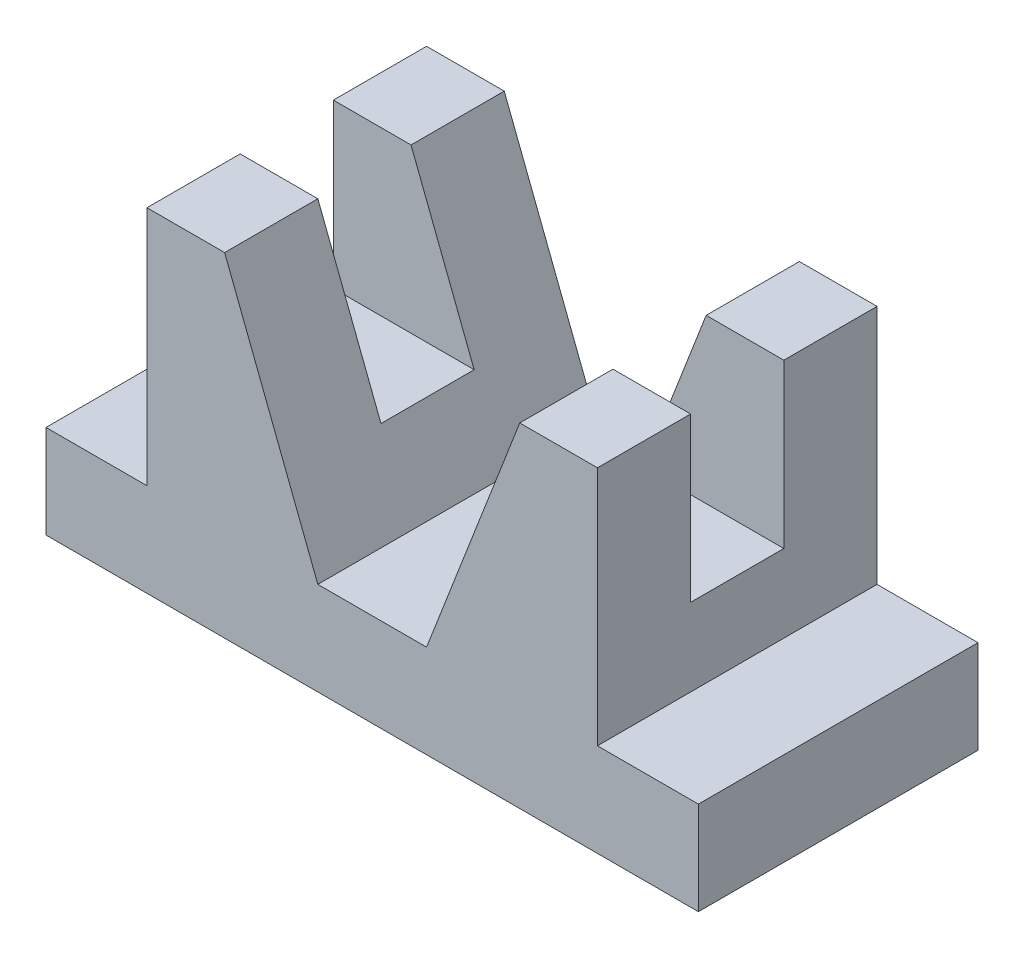
ISO-10303-21;
HEADER;
FILE_DESCRIPTION(('STEP AP214'),'2;1');
FILE_NAME('part.step','',(''),(''),'','','');
FILE_SCHEMA(('AUTOMOTIVE_DESIGN { 1 0 10303 214 1 1 1 1 }'));
ENDSEC;
DATA;
#1=APPLICATION_CONTEXT('core data for automotive mechanical design processes');
#2=APPLICATION_PROTOCOL_DEFINITION('international standard','automotive_design',2000,#1);
#3=PRODUCT_CONTEXT('',#1,'mechanical');
#4=PRODUCT('Part','Part','',(#3));
#5=PRODUCT_RELATED_PRODUCT_CATEGORY('part','',(#4));
#6=PRODUCT_DEFINITION_FORMATION('','',#4);
#7=PRODUCT_DEFINITION_CONTEXT('part definition',#1,'design');
#8=PRODUCT_DEFINITION('design','',#6,#7);
#9=PRODUCT_DEFINITION_SHAPE('','',#8);
#10=(LENGTH_UNIT() NAMED_UNIT(*) SI_UNIT(.MILLI.,.METRE.));
#11=(NAMED_UNIT(*) PLANE_ANGLE_UNIT() SI_UNIT($,.RADIAN.));
#12=(NAMED_UNIT(*) SI_UNIT($,.STERADIAN.) SOLID_ANGLE_UNIT());
#13=UNCERTAINTY_MEASURE_WITH_UNIT(LENGTH_MEASURE(1.E-05),#10,'distance_accuracy_value','');
#14=(GEOMETRIC_REPRESENTATION_CONTEXT(3) GLOBAL_UNCERTAINTY_ASSIGNED_CONTEXT((#13)) GLOBAL_UNIT_ASSIGNED_CONTEXT((#10,
#11,#12)) REPRESENTATION_CONTEXT('',''));
#15=CARTESIAN_POINT('',(0.,0.,0.));
#16=DIRECTION('',(0.,0.,1.));
#17=DIRECTION('',(1.,0.,0.));
#18=AXIS2_PLACEMENT_3D('',#15,#16,#17);
#19=CARTESIAN_POINT('',(-29.,37.,-36.));
#20=DIRECTION('',(0.,1.,0.));
#21=DIRECTION('',(-1.,0.,0.));
#22=AXIS2_PLACEMENT_3D('',#19,#20,#21);
#23=PLANE('',#22);
#24=DIRECTION('',(-1.,0.,0.));
#25=VECTOR('',#24,1.);
#26=CARTESIAN_POINT('',(-29.,37.,-24.));
#27=LINE('',#26,#25);
#28=CARTESIAN_POINT('',(-19.,37.,-24.));
#29=VERTEX_POINT('',#28);
#30=CARTESIAN_POINT('',(-29.,37.,-24.));
#31=VERTEX_POINT('',#30);
#32=EDGE_CURVE('E186',#29,#31,#27,.T.);
#33=ORIENTED_EDGE('',*,*,#32,.F.);
#34=DIRECTION('',(0.,0.,1.));
#35=VECTOR('',#34,1.);
#36=CARTESIAN_POINT('',(-19.,37.,-36.));
#37=LINE('',#36,#35);
#38=CARTESIAN_POINT('',(-19.,37.,-36.));
#39=VERTEX_POINT('',#38);
#40=EDGE_CURVE('E301',#39,#29,#37,.T.);
#41=ORIENTED_EDGE('',*,*,#40,.F.);
#42=DIRECTION('',(-1.,0.,0.));
#43=VECTOR('',#42,1.);
#44=CARTESIAN_POINT('',(-29.,37.,-36.));
#45=LINE('',#44,#43);
#46=CARTESIAN_POINT('',(-29.,37.,-36.));
#47=VERTEX_POINT('',#46);
#48=EDGE_CURVE('E249',#39,#47,#45,.T.);
#49=ORIENTED_EDGE('',*,*,#48,.T.);
#50=DIRECTION('',(0.,0.,1.));
#51=VECTOR('',#50,1.);
#52=CARTESIAN_POINT('',(-29.,37.,-36.));
#53=LINE('',#52,#51);
#54=EDGE_CURVE('E298',#47,#31,#53,.T.);
#55=ORIENTED_EDGE('',*,*,#54,.T.);
#56=EDGE_LOOP('',(#33,#41,#49,#55));
#57=FACE_BOUND('',#56,.T.);
#58=ADVANCED_FACE('F36',(#57),#23,.T.);
#59=CARTESIAN_POINT('',(29.,37.,-36.));
#60=DIRECTION('',(0.,1.,0.));
#61=DIRECTION('',(-1.,0.,0.));
#62=AXIS2_PLACEMENT_3D('',#59,#60,#61);
#63=PLANE('',#62);
#64=DIRECTION('',(-1.,0.,0.));
#65=VECTOR('',#64,1.);
#66=CARTESIAN_POINT('',(6.99999999999998,37.,-24.));
#67=LINE('',#66,#65);
#68=CARTESIAN_POINT('',(29.,37.,-24.));
#69=VERTEX_POINT('',#68);
#70=CARTESIAN_POINT('',(19.,37.,-24.));
#71=VERTEX_POINT('',#70);
#72=EDGE_CURVE('E203',#69,#71,#67,.T.);
#73=ORIENTED_EDGE('',*,*,#72,.F.);
#74=DIRECTION('',(0.,0.,1.));
#75=VECTOR('',#74,1.);
#76=CARTESIAN_POINT('',(29.,37.,-36.));
#77=LINE('',#76,#75);
#78=CARTESIAN_POINT('',(29.,37.,-36.));
#79=VERTEX_POINT('',#78);
#80=EDGE_CURVE('E313',#79,#69,#77,.T.);
#81=ORIENTED_EDGE('',*,*,#80,.F.);
#82=DIRECTION('',(-1.,0.,0.));
#83=VECTOR('',#82,1.);
#84=CARTESIAN_POINT('',(29.,37.,-36.));
#85=LINE('',#84,#83);
#86=CARTESIAN_POINT('',(19.,37.,-36.));
#87=VERTEX_POINT('',#86);
#88=EDGE_CURVE('E237',#79,#87,#85,.T.);
#89=ORIENTED_EDGE('',*,*,#88,.T.);
#90=DIRECTION('',(0.,0.,1.));
#91=VECTOR('',#90,1.);
#92=CARTESIAN_POINT('',(19.,37.,-36.));
#93=LINE('',#92,#91);
#94=EDGE_CURVE('E309',#87,#71,#93,.T.);
#95=ORIENTED_EDGE('',*,*,#94,.T.);
#96=EDGE_LOOP('',(#73,#81,#89,#95));
#97=FACE_BOUND('',#96,.T.);
#98=ADVANCED_FACE('F352',(#97),#63,.T.);
#99=CARTESIAN_POINT('',(-42.,6.,-36.));
#100=DIRECTION('',(-1.,0.,0.));
#101=DIRECTION('',(0.,0.,1.));
#102=AXIS2_PLACEMENT_3D('',#99,#100,#101);
#103=PLANE('',#102);
#104=DIRECTION('',(0.,-1.,0.));
#105=VECTOR('',#104,1.);
#106=CARTESIAN_POINT('',(-42.,6.,0.));
#107=LINE('',#106,#105);
#108=CARTESIAN_POINT('',(-42.,6.,0.));
#109=VERTEX_POINT('',#108);
#110=CARTESIAN_POINT('',(-42.,-6.,0.));
#111=VERTEX_POINT('',#110);
#112=EDGE_CURVE('E220',#109,#111,#107,.T.);
#113=ORIENTED_EDGE('',*,*,#112,.F.);
#114=DIRECTION('',(0.,0.,1.));
#115=VECTOR('',#114,1.);
#116=CARTESIAN_POINT('',(-42.,6.,-36.));
#117=LINE('',#116,#115);
#118=CARTESIAN_POINT('',(-42.,6.,-36.));
#119=VERTEX_POINT('',#118);
#120=EDGE_CURVE('E293',#119,#109,#117,.T.);
#121=ORIENTED_EDGE('',*,*,#120,.F.);
#122=DIRECTION('',(0.,-1.,0.));
#123=VECTOR('',#122,1.);
#124=CARTESIAN_POINT('',(-42.,6.,-36.));
#125=LINE('',#124,#123);
#126=CARTESIAN_POINT('',(-42.,-6.,-36.));
#127=VERTEX_POINT('',#126);
#128=EDGE_CURVE('E221',#119,#127,#125,.T.);
#129=ORIENTED_EDGE('',*,*,#128,.T.);
#130=DIRECTION('',(0.,0.,1.));
#131=VECTOR('',#130,1.);
#132=CARTESIAN_POINT('',(-42.,-6.,-36.));
#133=LINE('',#132,#131);
#134=EDGE_CURVE('E258',#127,#111,#133,.T.);
#135=ORIENTED_EDGE('',*,*,#134,.T.);
#136=EDGE_LOOP('',(#113,#121,#129,#135));
#137=FACE_BOUND('',#136,.T.);
#138=ADVANCED_FACE('F38',(#137),#103,.T.);
#139=CARTESIAN_POINT('',(-42.,6.,-36.));
#140=DIRECTION('',(0.,1.,0.));
#141=DIRECTION('',(-1.,0.,0.));
#142=AXIS2_PLACEMENT_3D('',#139,#140,#141);
#143=PLANE('',#142);
#144=DIRECTION('',(-1.,0.,0.));
#145=VECTOR('',#144,1.);
#146=CARTESIAN_POINT('',(-42.,6.,0.));
#147=LINE('',#146,#145);
#148=CARTESIAN_POINT('',(-29.,6.,0.));
#149=VERTEX_POINT('',#148);
#150=EDGE_CURVE('E225',#149,#109,#147,.T.);
#151=ORIENTED_EDGE('',*,*,#150,.F.);
#152=DIRECTION('',(0.,0.,1.));
#153=VECTOR('',#152,1.);
#154=CARTESIAN_POINT('',(-29.,6.,-36.));
#155=LINE('',#154,#153);
#156=CARTESIAN_POINT('',(-29.,6.,-36.));
#157=VERTEX_POINT('',#156);
#158=EDGE_CURVE('E296',#157,#149,#155,.T.);
#159=ORIENTED_EDGE('',*,*,#158,.F.);
#160=DIRECTION('',(-1.,0.,0.));
#161=VECTOR('',#160,1.);
#162=CARTESIAN_POINT('',(-42.,6.,-36.));
#163=LINE('',#162,#161);
#164=EDGE_CURVE('E255',#157,#119,#163,.T.);
#165=ORIENTED_EDGE('',*,*,#164,.T.);
#166=ORIENTED_EDGE('',*,*,#120,.T.);
#167=EDGE_LOOP('',(#151,#159,#165,#166));
#168=FACE_BOUND('',#167,.T.);
#169=ADVANCED_FACE('F374',(#168),#143,.T.);
#170=CARTESIAN_POINT('',(-29.,6.,-36.));
#171=DIRECTION('',(-1.,0.,0.));
#172=DIRECTION('',(0.,-1.,0.));
#173=AXIS2_PLACEMENT_3D('',#170,#171,#172);
#174=PLANE('',#173);
#175=DIRECTION('',(0.,1.,0.));
#176=VECTOR('',#175,1.);
#177=CARTESIAN_POINT('',(-29.,16.,-24.));
#178=LINE('',#177,#176);
#179=CARTESIAN_POINT('',(-29.,16.,-24.));
#180=VERTEX_POINT('',#179);
#181=EDGE_CURVE('E192',#180,#31,#178,.T.);
#182=ORIENTED_EDGE('',*,*,#181,.T.);
#183=ORIENTED_EDGE('',*,*,#54,.F.);
#184=DIRECTION('',(0.,-1.,0.));
#185=VECTOR('',#184,1.);
#186=CARTESIAN_POINT('',(-29.,6.,-36.));
#187=LINE('',#186,#185);
#188=EDGE_CURVE('E252',#47,#157,#187,.T.);
#189=ORIENTED_EDGE('',*,*,#188,.T.);
#190=ORIENTED_EDGE('',*,*,#158,.T.);
#191=DIRECTION('',(0.,-1.,0.));
#192=VECTOR('',#191,1.);
#193=CARTESIAN_POINT('',(-29.,6.,0.));
#194=LINE('',#193,#192);
#195=CARTESIAN_POINT('',(-29.,37.,0.));
#196=VERTEX_POINT('',#195);
#197=EDGE_CURVE('E288',#196,#149,#194,.T.);
#198=ORIENTED_EDGE('',*,*,#197,.F.);
#199=CARTESIAN_POINT('',(-29.,37.,-12.));
#200=VERTEX_POINT('',#199);
#201=EDGE_CURVE('E191',#200,#196,#53,.T.);
#202=ORIENTED_EDGE('',*,*,#201,.F.);
#203=DIRECTION('',(0.,1.,0.));
#204=VECTOR('',#203,1.);
#205=CARTESIAN_POINT('',(-29.,16.,-12.));
#206=LINE('',#205,#204);
#207=CARTESIAN_POINT('',(-29.,16.,-12.));
#208=VERTEX_POINT('',#207);
#209=EDGE_CURVE('E173',#208,#200,#206,.T.);
#210=ORIENTED_EDGE('',*,*,#209,.F.);
#211=DIRECTION('',(0.,0.,1.));
#212=VECTOR('',#211,1.);
#213=CARTESIAN_POINT('',(-29.,16.,-24.));
#214=LINE('',#213,#212);
#215=EDGE_CURVE('E178',#180,#208,#214,.T.);
#216=ORIENTED_EDGE('',*,*,#215,.F.);
#217=EDGE_LOOP('',(#182,#183,#189,#190,#198,#202,#210,#216));
#218=FACE_BOUND('',#217,.T.);
#219=ADVANCED_FACE('F189',(#218),#174,.T.);
#220=DIRECTION('',(1.,0.,0.));
#221=VECTOR('',#220,1.);
#222=CARTESIAN_POINT('',(-29.,37.,-12.));
#223=LINE('',#222,#221);
#224=CARTESIAN_POINT('',(-19.,37.,-12.));
#225=VERTEX_POINT('',#224);
#226=EDGE_CURVE('E208',#200,#225,#223,.T.);
#227=ORIENTED_EDGE('',*,*,#226,.F.);
#228=ORIENTED_EDGE('',*,*,#201,.T.);
#229=DIRECTION('',(-1.,0.,0.));
#230=VECTOR('',#229,1.);
#231=CARTESIAN_POINT('',(-29.,37.,0.));
#232=LINE('',#231,#230);
#233=CARTESIAN_POINT('',(-19.,37.,0.));
#234=VERTEX_POINT('',#233);
#235=EDGE_CURVE('E285',#234,#196,#232,.T.);
#236=ORIENTED_EDGE('',*,*,#235,.F.);
#237=EDGE_CURVE('E304',#225,#234,#37,.T.);
#238=ORIENTED_EDGE('',*,*,#237,.F.);
#239=EDGE_LOOP('',(#227,#228,#236,#238));
#240=FACE_BOUND('',#239,.T.);
#241=ADVANCED_FACE('F379',(#240),#23,.T.);
#242=CARTESIAN_POINT('',(-19.,37.,-36.));
#243=DIRECTION('',(0.932568098274089,0.360994102557712,0.));
#244=DIRECTION('',(-0.360994102557712,0.93256809827409,0.));
#245=AXIS2_PLACEMENT_3D('',#242,#243,#244);
#246=PLANE('',#245);
#247=DIRECTION('',(-0.360994102557712,0.93256809827409,0.));
#248=VECTOR('',#247,1.);
#249=CARTESIAN_POINT('',(-19.,37.,-24.));
#250=LINE('',#249,#248);
#251=CARTESIAN_POINT('',(-10.8709677419355,16.,-24.));
#252=VERTEX_POINT('',#251);
#253=EDGE_CURVE('E11',#252,#29,#250,.T.);
#254=ORIENTED_EDGE('',*,*,#253,.F.);
#255=DIRECTION('',(0.,0.,1.));
#256=VECTOR('',#255,1.);
#257=CARTESIAN_POINT('',(-10.8709677419355,16.,-36.));
#258=LINE('',#257,#256);
#259=CARTESIAN_POINT('',(-10.8709677419355,16.,-12.));
#260=VERTEX_POINT('',#259);
#261=EDGE_CURVE('E295',#252,#260,#258,.T.);
#262=ORIENTED_EDGE('',*,*,#261,.T.);
#263=DIRECTION('',(0.360994102557712,-0.93256809827409,0.));
#264=VECTOR('',#263,1.);
#265=CARTESIAN_POINT('',(-19.,37.,-12.));
#266=LINE('',#265,#264);
#267=EDGE_CURVE('E44',#225,#260,#266,.T.);
#268=ORIENTED_EDGE('',*,*,#267,.F.);
#269=ORIENTED_EDGE('',*,*,#237,.T.);
#270=DIRECTION('',(-0.360994102557712,0.93256809827409,0.));
#271=VECTOR('',#270,1.);
#272=CARTESIAN_POINT('',(-19.,37.,0.));
#273=LINE('',#272,#271);
#274=CARTESIAN_POINT('',(-7.,6.,0.));
#275=VERTEX_POINT('',#274);
#276=EDGE_CURVE('E282',#275,#234,#273,.T.);
#277=ORIENTED_EDGE('',*,*,#276,.F.);
#278=DIRECTION('',(0.,0.,1.));
#279=VECTOR('',#278,1.);
#280=CARTESIAN_POINT('',(-7.,6.,-36.));
#281=LINE('',#280,#279);
#282=CARTESIAN_POINT('',(-7.,6.,-36.));
#283=VERTEX_POINT('',#282);
#284=EDGE_CURVE('E305',#283,#275,#281,.T.);
#285=ORIENTED_EDGE('',*,*,#284,.F.);
#286=DIRECTION('',(-0.360994102557712,0.93256809827409,0.));
#287=VECTOR('',#286,1.);
#288=CARTESIAN_POINT('',(-19.,37.,-36.));
#289=LINE('',#288,#287);
#290=EDGE_CURVE('E246',#283,#39,#289,.T.);
#291=ORIENTED_EDGE('',*,*,#290,.T.);
#292=ORIENTED_EDGE('',*,*,#40,.T.);
#293=EDGE_LOOP('',(#254,#262,#268,#269,#277,#285,#291,#292));
#294=FACE_BOUND('',#293,.T.);
#295=ADVANCED_FACE('F326',(#294),#246,.T.);
#296=CARTESIAN_POINT('',(-7.,6.,-36.));
#297=DIRECTION('',(0.,1.,0.));
#298=DIRECTION('',(0.,0.,1.));
#299=AXIS2_PLACEMENT_3D('',#296,#297,#298);
#300=PLANE('',#299);
#301=DIRECTION('',(-1.,0.,0.));
#302=VECTOR('',#301,1.);
#303=CARTESIAN_POINT('',(-7.,6.,0.));
#304=LINE('',#303,#302);
#305=CARTESIAN_POINT('',(7.,6.,0.));
#306=VERTEX_POINT('',#305);
#307=EDGE_CURVE('E279',#306,#275,#304,.T.);
#308=ORIENTED_EDGE('',*,*,#307,.F.);
#309=DIRECTION('',(0.,0.,1.));
#310=VECTOR('',#309,1.);
#311=CARTESIAN_POINT('',(7.,6.,-36.));
#312=LINE('',#311,#310);
#313=CARTESIAN_POINT('',(7.,6.,-36.));
#314=VERTEX_POINT('',#313);
#315=EDGE_CURVE('E307',#314,#306,#312,.T.);
#316=ORIENTED_EDGE('',*,*,#315,.F.);
#317=DIRECTION('',(-1.,0.,0.));
#318=VECTOR('',#317,1.);
#319=CARTESIAN_POINT('',(-7.,6.,-36.));
#320=LINE('',#319,#318);
#321=EDGE_CURVE('E243',#314,#283,#320,.T.);
#322=ORIENTED_EDGE('',*,*,#321,.T.);
#323=ORIENTED_EDGE('',*,*,#284,.T.);
#324=EDGE_LOOP('',(#308,#316,#322,#323));
#325=FACE_BOUND('',#324,.T.);
#326=ADVANCED_FACE('F343',(#325),#300,.T.);
#327=CARTESIAN_POINT('',(19.,37.,-36.));
#328=DIRECTION('',(-0.932568098274089,0.360994102557712,0.));
#329=DIRECTION('',(-0.360994102557712,-0.93256809827409,0.));
#330=AXIS2_PLACEMENT_3D('',#327,#328,#329);
#331=PLANE('',#330);
#332=DIRECTION('',(-0.360994102557712,-0.93256809827409,0.));
#333=VECTOR('',#332,1.);
#334=CARTESIAN_POINT('',(19.,37.,-24.));
#335=LINE('',#334,#333);
#336=CARTESIAN_POINT('',(10.8709677419355,16.,-24.));
#337=VERTEX_POINT('',#336);
#338=EDGE_CURVE('E218',#71,#337,#335,.T.);
#339=ORIENTED_EDGE('',*,*,#338,.F.);
#340=ORIENTED_EDGE('',*,*,#94,.F.);
#341=DIRECTION('',(-0.360994102557712,-0.93256809827409,0.));
#342=VECTOR('',#341,1.);
#343=CARTESIAN_POINT('',(19.,37.,-36.));
#344=LINE('',#343,#342);
#345=EDGE_CURVE('E240',#87,#314,#344,.T.);
#346=ORIENTED_EDGE('',*,*,#345,.T.);
#347=ORIENTED_EDGE('',*,*,#315,.T.);
#348=DIRECTION('',(-0.360994102557712,-0.93256809827409,0.));
#349=VECTOR('',#348,1.);
#350=CARTESIAN_POINT('',(19.,37.,0.));
#351=LINE('',#350,#349);
#352=CARTESIAN_POINT('',(19.,37.,0.));
#353=VERTEX_POINT('',#352);
#354=EDGE_CURVE('E276',#353,#306,#351,.T.);
#355=ORIENTED_EDGE('',*,*,#354,.F.);
#356=CARTESIAN_POINT('',(19.,37.,-12.));
#357=VERTEX_POINT('',#356);
#358=EDGE_CURVE('E312',#357,#353,#93,.T.);
#359=ORIENTED_EDGE('',*,*,#358,.F.);
#360=DIRECTION('',(0.360994102557712,0.93256809827409,0.));
#361=VECTOR('',#360,1.);
#362=CARTESIAN_POINT('',(19.,37.,-12.));
#363=LINE('',#362,#361);
#364=CARTESIAN_POINT('',(10.8709677419355,16.,-12.));
#365=VERTEX_POINT('',#364);
#366=EDGE_CURVE('E216',#365,#357,#363,.T.);
#367=ORIENTED_EDGE('',*,*,#366,.F.);
#368=DIRECTION('',(0.,0.,-1.));
#369=VECTOR('',#368,1.);
#370=CARTESIAN_POINT('',(10.8709677419355,16.,-36.));
#371=LINE('',#370,#369);
#372=EDGE_CURVE('E194',#365,#337,#371,.T.);
#373=ORIENTED_EDGE('',*,*,#372,.T.);
#374=EDGE_LOOP('',(#339,#340,#346,#347,#355,#359,#367,#373));
#375=FACE_BOUND('',#374,.T.);
#376=ADVANCED_FACE('F348',(#375),#331,.T.);
#377=DIRECTION('',(1.,0.,0.));
#378=VECTOR('',#377,1.);
#379=CARTESIAN_POINT('',(6.99999999999998,37.,-12.));
#380=LINE('',#379,#378);
#381=CARTESIAN_POINT('',(29.,37.,-12.));
#382=VERTEX_POINT('',#381);
#383=EDGE_CURVE('E205',#357,#382,#380,.T.);
#384=ORIENTED_EDGE('',*,*,#383,.F.);
#385=ORIENTED_EDGE('',*,*,#358,.T.);
#386=DIRECTION('',(-1.,0.,0.));
#387=VECTOR('',#386,1.);
#388=CARTESIAN_POINT('',(29.,37.,0.));
#389=LINE('',#388,#387);
#390=CARTESIAN_POINT('',(29.,37.,0.));
#391=VERTEX_POINT('',#390);
#392=EDGE_CURVE('E273',#391,#353,#389,.T.);
#393=ORIENTED_EDGE('',*,*,#392,.F.);
#394=EDGE_CURVE('E316',#382,#391,#77,.T.);
#395=ORIENTED_EDGE('',*,*,#394,.F.);
#396=EDGE_LOOP('',(#384,#385,#393,#395));
#397=FACE_BOUND('',#396,.T.);
#398=ADVANCED_FACE('F394',(#397),#63,.T.);
#399=CARTESIAN_POINT('',(29.,6.,-36.));
#400=DIRECTION('',(1.,0.,0.));
#401=DIRECTION('',(0.,1.,0.));
#402=AXIS2_PLACEMENT_3D('',#399,#400,#401);
#403=PLANE('',#402);
#404=DIRECTION('',(0.,1.,0.));
#405=VECTOR('',#404,1.);
#406=CARTESIAN_POINT('',(29.,16.,-24.));
#407=LINE('',#406,#405);
#408=CARTESIAN_POINT('',(29.,16.,-24.));
#409=VERTEX_POINT('',#408);
#410=EDGE_CURVE('E201',#409,#69,#407,.T.);
#411=ORIENTED_EDGE('',*,*,#410,.F.);
#412=DIRECTION('',(0.,0.,-1.));
#413=VECTOR('',#412,1.);
#414=CARTESIAN_POINT('',(29.,16.,-24.));
#415=LINE('',#414,#413);
#416=CARTESIAN_POINT('',(29.,16.,-12.));
#417=VERTEX_POINT('',#416);
#418=EDGE_CURVE('E211',#417,#409,#415,.T.);
#419=ORIENTED_EDGE('',*,*,#418,.F.);
#420=DIRECTION('',(0.,1.,0.));
#421=VECTOR('',#420,1.);
#422=CARTESIAN_POINT('',(29.,16.,-12.));
#423=LINE('',#422,#421);
#424=EDGE_CURVE('E59',#417,#382,#423,.T.);
#425=ORIENTED_EDGE('',*,*,#424,.T.);
#426=ORIENTED_EDGE('',*,*,#394,.T.);
#427=DIRECTION('',(0.,1.,0.));
#428=VECTOR('',#427,1.);
#429=CARTESIAN_POINT('',(29.,6.,0.));
#430=LINE('',#429,#428);
#431=CARTESIAN_POINT('',(29.,6.,0.));
#432=VERTEX_POINT('',#431);
#433=EDGE_CURVE('E270',#432,#391,#430,.T.);
#434=ORIENTED_EDGE('',*,*,#433,.F.);
#435=DIRECTION('',(0.,0.,1.));
#436=VECTOR('',#435,1.);
#437=CARTESIAN_POINT('',(29.,6.,-36.));
#438=LINE('',#437,#436);
#439=CARTESIAN_POINT('',(29.,6.,-36.));
#440=VERTEX_POINT('',#439);
#441=EDGE_CURVE('E317',#440,#432,#438,.T.);
#442=ORIENTED_EDGE('',*,*,#441,.F.);
#443=DIRECTION('',(0.,1.,0.));
#444=VECTOR('',#443,1.);
#445=CARTESIAN_POINT('',(29.,6.,-36.));
#446=LINE('',#445,#444);
#447=EDGE_CURVE('E234',#440,#79,#446,.T.);
#448=ORIENTED_EDGE('',*,*,#447,.T.);
#449=ORIENTED_EDGE('',*,*,#80,.T.);
#450=EDGE_LOOP('',(#411,#419,#425,#426,#434,#442,#448,#449));
#451=FACE_BOUND('',#450,.T.);
#452=ADVANCED_FACE('F357',(#451),#403,.T.);
#453=CARTESIAN_POINT('',(29.,6.,-36.));
#454=DIRECTION('',(0.,1.,0.));
#455=DIRECTION('',(-1.,0.,0.));
#456=AXIS2_PLACEMENT_3D('',#453,#454,#455);
#457=PLANE('',#456);
#458=DIRECTION('',(-1.,0.,0.));
#459=VECTOR('',#458,1.);
#460=CARTESIAN_POINT('',(29.,6.,0.));
#461=LINE('',#460,#459);
#462=CARTESIAN_POINT('',(42.,6.,0.));
#463=VERTEX_POINT('',#462);
#464=EDGE_CURVE('E267',#463,#432,#461,.T.);
#465=ORIENTED_EDGE('',*,*,#464,.F.);
#466=DIRECTION('',(0.,0.,1.));
#467=VECTOR('',#466,1.);
#468=CARTESIAN_POINT('',(42.,6.,-36.));
#469=LINE('',#468,#467);
#470=CARTESIAN_POINT('',(42.,6.,-36.));
#471=VERTEX_POINT('',#470);
#472=EDGE_CURVE('E319',#471,#463,#469,.T.);
#473=ORIENTED_EDGE('',*,*,#472,.F.);
#474=DIRECTION('',(-1.,0.,0.));
#475=VECTOR('',#474,1.);
#476=CARTESIAN_POINT('',(29.,6.,-36.));
#477=LINE('',#476,#475);
#478=EDGE_CURVE('E231',#471,#440,#477,.T.);
#479=ORIENTED_EDGE('',*,*,#478,.T.);
#480=ORIENTED_EDGE('',*,*,#441,.T.);
#481=EDGE_LOOP('',(#465,#473,#479,#480));
#482=FACE_BOUND('',#481,.T.);
#483=ADVANCED_FACE('F361',(#482),#457,.T.);
#484=CARTESIAN_POINT('',(42.,6.,-36.));
#485=DIRECTION('',(1.,0.,0.));
#486=DIRECTION('',(0.,0.,-1.));
#487=AXIS2_PLACEMENT_3D('',#484,#485,#486);
#488=PLANE('',#487);
#489=DIRECTION('',(0.,1.,0.));
#490=VECTOR('',#489,1.);
#491=CARTESIAN_POINT('',(42.,6.,0.));
#492=LINE('',#491,#490);
#493=CARTESIAN_POINT('',(42.,-6.,0.));
#494=VERTEX_POINT('',#493);
#495=EDGE_CURVE('E264',#494,#463,#492,.T.);
#496=ORIENTED_EDGE('',*,*,#495,.F.);
#497=DIRECTION('',(0.,0.,1.));
#498=VECTOR('',#497,1.);
#499=CARTESIAN_POINT('',(42.,-6.,-36.));
#500=LINE('',#499,#498);
#501=CARTESIAN_POINT('',(42.,-6.,-36.));
#502=VERTEX_POINT('',#501);
#503=EDGE_CURVE('E321',#502,#494,#500,.T.);
#504=ORIENTED_EDGE('',*,*,#503,.F.);
#505=DIRECTION('',(0.,1.,0.));
#506=VECTOR('',#505,1.);
#507=CARTESIAN_POINT('',(42.,6.,-36.));
#508=LINE('',#507,#506);
#509=EDGE_CURVE('E228',#502,#471,#508,.T.);
#510=ORIENTED_EDGE('',*,*,#509,.T.);
#511=ORIENTED_EDGE('',*,*,#472,.T.);
#512=EDGE_LOOP('',(#496,#504,#510,#511));
#513=FACE_BOUND('',#512,.T.);
#514=ADVANCED_FACE('F366',(#513),#488,.T.);
#515=CARTESIAN_POINT('',(-42.,-6.,-36.));
#516=DIRECTION('',(0.,-1.,0.));
#517=DIRECTION('',(0.,0.,-1.));
#518=AXIS2_PLACEMENT_3D('',#515,#516,#517);
#519=PLANE('',#518);
#520=DIRECTION('',(1.,0.,0.));
#521=VECTOR('',#520,1.);
#522=CARTESIAN_POINT('',(-42.,-6.,0.));
#523=LINE('',#522,#521);
#524=EDGE_CURVE('E261',#111,#494,#523,.T.);
#525=ORIENTED_EDGE('',*,*,#524,.F.);
#526=ORIENTED_EDGE('',*,*,#134,.F.);
#527=DIRECTION('',(1.,0.,0.));
#528=VECTOR('',#527,1.);
#529=CARTESIAN_POINT('',(-42.,-6.,-36.));
#530=LINE('',#529,#528);
#531=EDGE_CURVE('E224',#127,#502,#530,.T.);
#532=ORIENTED_EDGE('',*,*,#531,.T.);
#533=ORIENTED_EDGE('',*,*,#503,.T.);
#534=EDGE_LOOP('',(#525,#526,#532,#533));
#535=FACE_BOUND('',#534,.T.);
#536=ADVANCED_FACE('F369',(#535),#519,.T.);
#537=CARTESIAN_POINT('',(0.,0.,-36.));
#538=DIRECTION('',(0.,0.,1.));
#539=DIRECTION('',(1.,0.,0.));
#540=AXIS2_PLACEMENT_3D('',#537,#538,#539);
#541=PLANE('',#540);
#542=ORIENTED_EDGE('',*,*,#128,.F.);
#543=ORIENTED_EDGE('',*,*,#164,.F.);
#544=ORIENTED_EDGE('',*,*,#188,.F.);
#545=ORIENTED_EDGE('',*,*,#48,.F.);
#546=ORIENTED_EDGE('',*,*,#290,.F.);
#547=ORIENTED_EDGE('',*,*,#321,.F.);
#548=ORIENTED_EDGE('',*,*,#345,.F.);
#549=ORIENTED_EDGE('',*,*,#88,.F.);
#550=ORIENTED_EDGE('',*,*,#447,.F.);
#551=ORIENTED_EDGE('',*,*,#478,.F.);
#552=ORIENTED_EDGE('',*,*,#509,.F.);
#553=ORIENTED_EDGE('',*,*,#531,.F.);
#554=EDGE_LOOP('',(#542,#543,#544,#545,#546,#547,#548,#549,#550,#551,#552,#553));
#555=FACE_BOUND('',#554,.T.);
#556=ADVANCED_FACE('F337',(#555),#541,.F.);
#557=CARTESIAN_POINT('',(0.,0.,0.));
#558=DIRECTION('',(0.,0.,1.));
#559=DIRECTION('',(1.,0.,0.));
#560=AXIS2_PLACEMENT_3D('',#557,#558,#559);
#561=PLANE('',#560);
#562=ORIENTED_EDGE('',*,*,#112,.T.);
#563=ORIENTED_EDGE('',*,*,#524,.T.);
#564=ORIENTED_EDGE('',*,*,#495,.T.);
#565=ORIENTED_EDGE('',*,*,#464,.T.);
#566=ORIENTED_EDGE('',*,*,#433,.T.);
#567=ORIENTED_EDGE('',*,*,#392,.T.);
#568=ORIENTED_EDGE('',*,*,#354,.T.);
#569=ORIENTED_EDGE('',*,*,#307,.T.);
#570=ORIENTED_EDGE('',*,*,#276,.T.);
#571=ORIENTED_EDGE('',*,*,#235,.T.);
#572=ORIENTED_EDGE('',*,*,#197,.T.);
#573=ORIENTED_EDGE('',*,*,#150,.T.);
#574=EDGE_LOOP('',(#562,#563,#564,#565,#566,#567,#568,#569,#570,#571,#572,#573));
#575=FACE_BOUND('',#574,.T.);
#576=ADVANCED_FACE('F376',(#575),#561,.T.);
#577=CARTESIAN_POINT('',(7.,16.,-24.));
#578=DIRECTION('',(0.,0.,-1.));
#579=DIRECTION('',(-1.,0.,0.));
#580=AXIS2_PLACEMENT_3D('',#577,#578,#579);
#581=PLANE('',#580);
#582=ORIENTED_EDGE('',*,*,#338,.T.);
#583=DIRECTION('',(-1.,0.,0.));
#584=VECTOR('',#583,1.);
#585=CARTESIAN_POINT('',(7.,16.,-24.));
#586=LINE('',#585,#584);
#587=EDGE_CURVE('E200',#409,#337,#586,.T.);
#588=ORIENTED_EDGE('',*,*,#587,.F.);
#589=ORIENTED_EDGE('',*,*,#410,.T.);
#590=ORIENTED_EDGE('',*,*,#72,.T.);
#591=EDGE_LOOP('',(#582,#588,#589,#590));
#592=FACE_BOUND('',#591,.T.);
#593=ADVANCED_FACE('F417',(#592),#581,.F.);
#594=CARTESIAN_POINT('',(7.,16.,-12.));
#595=DIRECTION('',(0.,0.,1.));
#596=DIRECTION('',(1.,0.,0.));
#597=AXIS2_PLACEMENT_3D('',#594,#595,#596);
#598=PLANE('',#597);
#599=ORIENTED_EDGE('',*,*,#366,.T.);
#600=ORIENTED_EDGE('',*,*,#383,.T.);
#601=ORIENTED_EDGE('',*,*,#424,.F.);
#602=DIRECTION('',(1.,0.,0.));
#603=VECTOR('',#602,1.);
#604=CARTESIAN_POINT('',(7.,16.,-12.));
#605=LINE('',#604,#603);
#606=EDGE_CURVE('E206',#365,#417,#605,.T.);
#607=ORIENTED_EDGE('',*,*,#606,.F.);
#608=EDGE_LOOP('',(#599,#600,#601,#607));
#609=FACE_BOUND('',#608,.T.);
#610=ADVANCED_FACE('F411',(#609),#598,.F.);
#611=CARTESIAN_POINT('',(0.,16.,0.));
#612=DIRECTION('',(0.,1.,0.));
#613=DIRECTION('',(-1.,0.,0.));
#614=AXIS2_PLACEMENT_3D('',#611,#612,#613);
#615=PLANE('',#614);
#616=ORIENTED_EDGE('',*,*,#606,.T.);
#617=ORIENTED_EDGE('',*,*,#418,.T.);
#618=ORIENTED_EDGE('',*,*,#587,.T.);
#619=ORIENTED_EDGE('',*,*,#372,.F.);
#620=EDGE_LOOP('',(#616,#617,#618,#619));
#621=FACE_BOUND('',#620,.T.);
#622=ADVANCED_FACE('F414',(#621),#615,.T.);
#623=CARTESIAN_POINT('',(-29.,16.,-24.));
#624=DIRECTION('',(0.,0.,-1.));
#625=DIRECTION('',(-1.,0.,0.));
#626=AXIS2_PLACEMENT_3D('',#623,#624,#625);
#627=PLANE('',#626);
#628=ORIENTED_EDGE('',*,*,#253,.T.);
#629=ORIENTED_EDGE('',*,*,#32,.T.);
#630=ORIENTED_EDGE('',*,*,#181,.F.);
#631=DIRECTION('',(-1.,0.,0.));
#632=VECTOR('',#631,1.);
#633=CARTESIAN_POINT('',(-29.,16.,-24.));
#634=LINE('',#633,#632);
#635=EDGE_CURVE('E177',#252,#180,#634,.T.);
#636=ORIENTED_EDGE('',*,*,#635,.F.);
#637=EDGE_LOOP('',(#628,#629,#630,#636));
#638=FACE_BOUND('',#637,.T.);
#639=ADVANCED_FACE('F329',(#638),#627,.F.);
#640=CARTESIAN_POINT('',(-29.,16.,-12.));
#641=DIRECTION('',(0.,0.,1.));
#642=DIRECTION('',(1.,0.,0.));
#643=AXIS2_PLACEMENT_3D('',#640,#641,#642);
#644=PLANE('',#643);
#645=ORIENTED_EDGE('',*,*,#267,.T.);
#646=DIRECTION('',(1.,0.,0.));
#647=VECTOR('',#646,1.);
#648=CARTESIAN_POINT('',(-29.,16.,-12.));
#649=LINE('',#648,#647);
#650=EDGE_CURVE('E51',#208,#260,#649,.T.);
#651=ORIENTED_EDGE('',*,*,#650,.F.);
#652=ORIENTED_EDGE('',*,*,#209,.T.);
#653=ORIENTED_EDGE('',*,*,#226,.T.);
#654=EDGE_LOOP('',(#645,#651,#652,#653));
#655=FACE_BOUND('',#654,.T.);
#656=ADVANCED_FACE('F171',(#655),#644,.F.);
#657=CARTESIAN_POINT('',(0.,16.,0.));
#658=DIRECTION('',(0.,1.,0.));
#659=DIRECTION('',(-1.,0.,0.));
#660=AXIS2_PLACEMENT_3D('',#657,#658,#659);
#661=PLANE('',#660);
#662=ORIENTED_EDGE('',*,*,#635,.T.);
#663=ORIENTED_EDGE('',*,*,#215,.T.);
#664=ORIENTED_EDGE('',*,*,#650,.T.);
#665=ORIENTED_EDGE('',*,*,#261,.F.);
#666=EDGE_LOOP('',(#662,#663,#664,#665));
#667=FACE_BOUND('',#666,.T.);
#668=ADVANCED_FACE('F181',(#667),#661,.T.);
#669=CLOSED_SHELL('',(#58,#98,#138,#169,#219,#241,#295,#326,#376,#398,#452,#483,#514,#536,#556,
#576,#593,#610,#622,#639,#656,#668));
#670=MANIFOLD_SOLID_BREP('B2',#669);
#671=ADVANCED_BREP_SHAPE_REPRESENTATION('',(#18,#670),#14);
#672=SHAPE_DEFINITION_REPRESENTATION(#9,#671);
ENDSEC;
END-ISO-10303-21;
